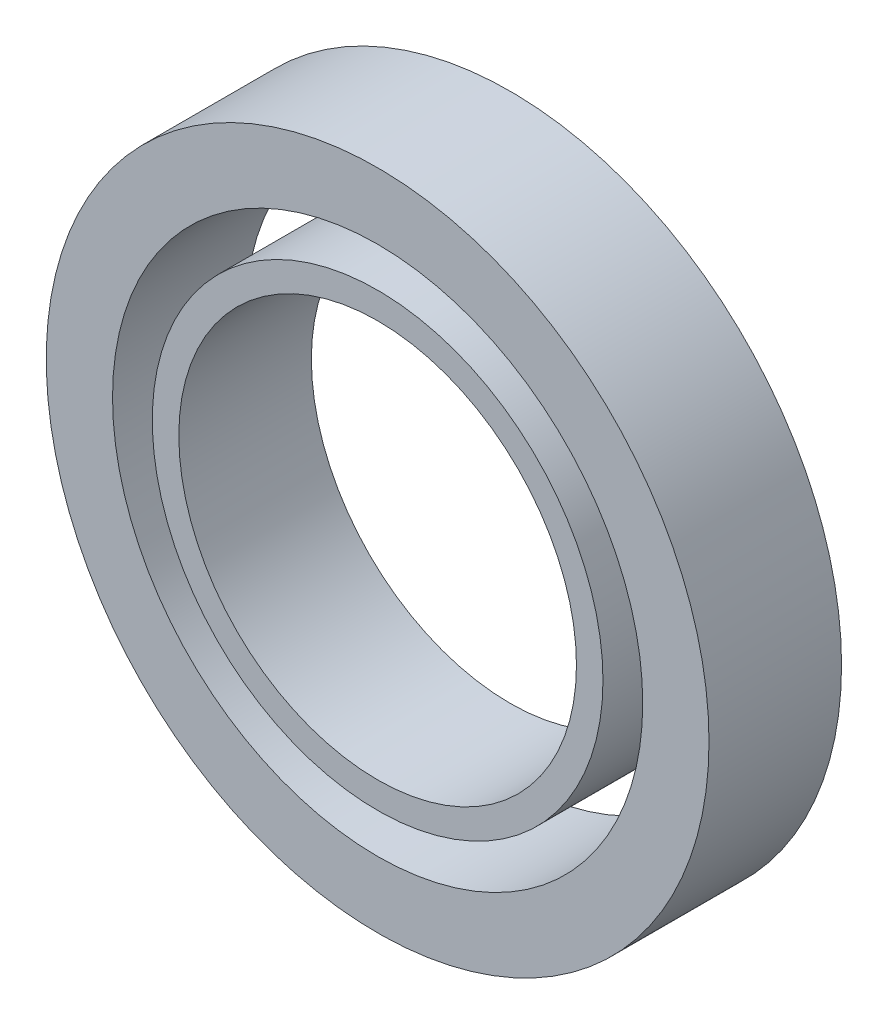
ISO-10303-21;
HEADER;
FILE_DESCRIPTION(('STEP AP214'),'2;1');
FILE_NAME('part.step','',(''),(''),'','','');
FILE_SCHEMA(('AUTOMOTIVE_DESIGN { 1 0 10303 214 1 1 1 1 }'));
ENDSEC;
DATA;
#1=APPLICATION_CONTEXT('core data for automotive mechanical design processes');
#2=APPLICATION_PROTOCOL_DEFINITION('international standard','automotive_design',2000,#1);
#3=PRODUCT_CONTEXT('',#1,'mechanical');
#4=PRODUCT('Part','Part','',(#3));
#5=PRODUCT_RELATED_PRODUCT_CATEGORY('part','',(#4));
#6=PRODUCT_DEFINITION_FORMATION('','',#4);
#7=PRODUCT_DEFINITION_CONTEXT('part definition',#1,'design');
#8=PRODUCT_DEFINITION('design','',#6,#7);
#9=PRODUCT_DEFINITION_SHAPE('','',#8);
#10=(LENGTH_UNIT() NAMED_UNIT(*) SI_UNIT(.MILLI.,.METRE.));
#11=(NAMED_UNIT(*) PLANE_ANGLE_UNIT() SI_UNIT($,.RADIAN.));
#12=(NAMED_UNIT(*) SI_UNIT($,.STERADIAN.) SOLID_ANGLE_UNIT());
#13=UNCERTAINTY_MEASURE_WITH_UNIT(LENGTH_MEASURE(1.E-05),#10,'distance_accuracy_value','');
#14=(GEOMETRIC_REPRESENTATION_CONTEXT(3) GLOBAL_UNCERTAINTY_ASSIGNED_CONTEXT((#13)) GLOBAL_UNIT_ASSIGNED_CONTEXT((#10,
#11,#12)) REPRESENTATION_CONTEXT('',''));
#15=CARTESIAN_POINT('',(0.,0.,0.));
#16=DIRECTION('',(0.,0.,1.));
#17=DIRECTION('',(1.,0.,0.));
#18=AXIS2_PLACEMENT_3D('',#15,#16,#17);
#19=CARTESIAN_POINT('',(0.,0.,1.));
#20=DIRECTION('',(0.,0.,1.));
#21=DIRECTION('',(1.,0.,0.));
#22=AXIS2_PLACEMENT_3D('',#19,#20,#21);
#23=PLANE('',#22);
#24=CARTESIAN_POINT('',(0.,0.,1.));
#25=DIRECTION('',(0.,0.,1.));
#26=DIRECTION('',(1.,0.,0.));
#27=AXIS2_PLACEMENT_3D('',#24,#25,#26);
#28=CIRCLE('',#27,1.7);
#29=CARTESIAN_POINT('',(1.7,0.,1.));
#30=VERTEX_POINT('',#29);
#31=EDGE_CURVE('E11',#30,#30,#28,.T.);
#32=ORIENTED_EDGE('',*,*,#31,.T.);
#33=EDGE_LOOP('',(#32));
#34=FACE_BOUND('',#33,.T.);
#35=CARTESIAN_POINT('',(0.,0.,1.));
#36=DIRECTION('',(0.,0.,1.));
#37=DIRECTION('',(1.,0.,0.));
#38=AXIS2_PLACEMENT_3D('',#35,#36,#37);
#39=CIRCLE('',#38,1.5);
#40=CARTESIAN_POINT('',(1.5,0.,1.));
#41=VERTEX_POINT('',#40);
#42=EDGE_CURVE('E50',#41,#41,#39,.T.);
#43=ORIENTED_EDGE('',*,*,#42,.F.);
#44=EDGE_LOOP('',(#43));
#45=FACE_BOUND('',#44,.T.);
#46=ADVANCED_FACE('F39',(#34,#45),#23,.T.);
#47=CARTESIAN_POINT('',(0.,0.,0.));
#48=DIRECTION('',(0.,0.,1.));
#49=DIRECTION('',(1.,0.,0.));
#50=AXIS2_PLACEMENT_3D('',#47,#48,#49);
#51=PLANE('',#50);
#52=CARTESIAN_POINT('',(0.,0.,0.));
#53=DIRECTION('',(0.,0.,1.));
#54=DIRECTION('',(1.,0.,0.));
#55=AXIS2_PLACEMENT_3D('',#52,#53,#54);
#56=CIRCLE('',#55,1.7);
#57=CARTESIAN_POINT('',(1.7,0.,0.));
#58=VERTEX_POINT('',#57);
#59=EDGE_CURVE('E43',#58,#58,#56,.T.);
#60=ORIENTED_EDGE('',*,*,#59,.F.);
#61=EDGE_LOOP('',(#60));
#62=FACE_BOUND('',#61,.T.);
#63=CARTESIAN_POINT('',(0.,0.,0.));
#64=DIRECTION('',(0.,0.,1.));
#65=DIRECTION('',(1.,0.,0.));
#66=AXIS2_PLACEMENT_3D('',#63,#64,#65);
#67=CIRCLE('',#66,1.5);
#68=CARTESIAN_POINT('',(1.5,0.,0.));
#69=VERTEX_POINT('',#68);
#70=EDGE_CURVE('E52',#69,#69,#67,.T.);
#71=ORIENTED_EDGE('',*,*,#70,.T.);
#72=EDGE_LOOP('',(#71));
#73=FACE_BOUND('',#72,.T.);
#74=ADVANCED_FACE('F62',(#62,#73),#51,.F.);
#75=CARTESIAN_POINT('',(0.,0.,1.));
#76=DIRECTION('',(0.,0.,-1.));
#77=DIRECTION('',(-1.,0.,0.));
#78=AXIS2_PLACEMENT_3D('',#75,#76,#77);
#79=CYLINDRICAL_SURFACE('',#78,1.7);
#80=ORIENTED_EDGE('',*,*,#31,.F.);
#81=EDGE_LOOP('',(#80));
#82=FACE_BOUND('',#81,.T.);
#83=ORIENTED_EDGE('',*,*,#59,.T.);
#84=EDGE_LOOP('',(#83));
#85=FACE_BOUND('',#84,.T.);
#86=ADVANCED_FACE('F41',(#82,#85),#79,.T.);
#87=CARTESIAN_POINT('',(0.,0.,1.));
#88=DIRECTION('',(0.,0.,-1.));
#89=DIRECTION('',(-1.,0.,0.));
#90=AXIS2_PLACEMENT_3D('',#87,#88,#89);
#91=CYLINDRICAL_SURFACE('',#90,1.5);
#92=ORIENTED_EDGE('',*,*,#42,.T.);
#93=EDGE_LOOP('',(#92));
#94=FACE_BOUND('',#93,.T.);
#95=ORIENTED_EDGE('',*,*,#70,.F.);
#96=EDGE_LOOP('',(#95));
#97=FACE_BOUND('',#96,.T.);
#98=ADVANCED_FACE('F58',(#94,#97),#91,.F.);
#99=CLOSED_SHELL('',(#46,#74,#86,#98));
#100=MANIFOLD_SOLID_BREP('B2',#99);
#101=CARTESIAN_POINT('',(0.,0.,1.));
#102=DIRECTION('',(0.,0.,-1.));
#103=DIRECTION('',(-1.,0.,0.));
#104=AXIS2_PLACEMENT_3D('',#101,#102,#103);
#105=CYLINDRICAL_SURFACE('',#104,2.);
#106=CARTESIAN_POINT('',(0.,0.,1.));
#107=DIRECTION('',(0.,0.,1.));
#108=DIRECTION('',(1.,0.,0.));
#109=AXIS2_PLACEMENT_3D('',#106,#107,#108);
#110=CIRCLE('',#109,2.);
#111=CARTESIAN_POINT('',(2.,0.,1.));
#112=VERTEX_POINT('',#111);
#113=EDGE_CURVE('E108',#112,#112,#110,.T.);
#114=ORIENTED_EDGE('',*,*,#113,.T.);
#115=EDGE_LOOP('',(#114));
#116=FACE_BOUND('',#115,.T.);
#117=CARTESIAN_POINT('',(0.,0.,0.));
#118=DIRECTION('',(0.,0.,1.));
#119=DIRECTION('',(1.,0.,0.));
#120=AXIS2_PLACEMENT_3D('',#117,#118,#119);
#121=CIRCLE('',#120,2.);
#122=CARTESIAN_POINT('',(2.,0.,0.));
#123=VERTEX_POINT('',#122);
#124=EDGE_CURVE('E114',#123,#123,#121,.T.);
#125=ORIENTED_EDGE('',*,*,#124,.F.);
#126=EDGE_LOOP('',(#125));
#127=FACE_BOUND('',#126,.T.);
#128=ADVANCED_FACE('F101',(#116,#127),#105,.F.);
#129=CARTESIAN_POINT('',(0.,0.,1.));
#130=DIRECTION('',(0.,0.,-1.));
#131=DIRECTION('',(-1.,0.,0.));
#132=AXIS2_PLACEMENT_3D('',#129,#130,#131);
#133=CYLINDRICAL_SURFACE('',#132,2.5);
#134=CARTESIAN_POINT('',(0.,0.,1.));
#135=DIRECTION('',(0.,0.,1.));
#136=DIRECTION('',(1.,0.,0.));
#137=AXIS2_PLACEMENT_3D('',#134,#135,#136);
#138=CIRCLE('',#137,2.5);
#139=CARTESIAN_POINT('',(2.5,0.,1.));
#140=VERTEX_POINT('',#139);
#141=EDGE_CURVE('E38',#140,#140,#138,.T.);
#142=ORIENTED_EDGE('',*,*,#141,.F.);
#143=EDGE_LOOP('',(#142));
#144=FACE_BOUND('',#143,.T.);
#145=CARTESIAN_POINT('',(0.,0.,0.));
#146=DIRECTION('',(0.,0.,1.));
#147=DIRECTION('',(1.,0.,0.));
#148=AXIS2_PLACEMENT_3D('',#145,#146,#147);
#149=CIRCLE('',#148,2.5);
#150=CARTESIAN_POINT('',(2.5,0.,0.));
#151=VERTEX_POINT('',#150);
#152=EDGE_CURVE('E104',#151,#151,#149,.T.);
#153=ORIENTED_EDGE('',*,*,#152,.T.);
#154=EDGE_LOOP('',(#153));
#155=FACE_BOUND('',#154,.T.);
#156=ADVANCED_FACE('F121',(#144,#155),#133,.T.);
#157=CARTESIAN_POINT('',(0.,-5.64142135623731,1.));
#158=DIRECTION('',(0.,0.,1.));
#159=DIRECTION('',(1.,0.,0.));
#160=AXIS2_PLACEMENT_3D('',#157,#158,#159);
#161=PLANE('',#160);
#162=ORIENTED_EDGE('',*,*,#113,.F.);
#163=EDGE_LOOP('',(#162));
#164=FACE_BOUND('',#163,.T.);
#165=ORIENTED_EDGE('',*,*,#141,.T.);
#166=EDGE_LOOP('',(#165));
#167=FACE_BOUND('',#166,.T.);
#168=ADVANCED_FACE('F125',(#164,#167),#161,.T.);
#169=CARTESIAN_POINT('',(0.,-5.64142135623731,0.));
#170=DIRECTION('',(0.,0.,1.));
#171=DIRECTION('',(1.,0.,0.));
#172=AXIS2_PLACEMENT_3D('',#169,#170,#171);
#173=PLANE('',#172);
#174=ORIENTED_EDGE('',*,*,#124,.T.);
#175=EDGE_LOOP('',(#174));
#176=FACE_BOUND('',#175,.T.);
#177=ORIENTED_EDGE('',*,*,#152,.F.);
#178=EDGE_LOOP('',(#177));
#179=FACE_BOUND('',#178,.T.);
#180=ADVANCED_FACE('F123',(#176,#179),#173,.F.);
#181=CLOSED_SHELL('',(#128,#156,#168,#180));
#182=MANIFOLD_SOLID_BREP('B6',#181);
#183=ADVANCED_BREP_SHAPE_REPRESENTATION('',(#18,#100,#182),#14);
#184=SHAPE_DEFINITION_REPRESENTATION(#9,#183);
ENDSEC;
END-ISO-10303-21;
